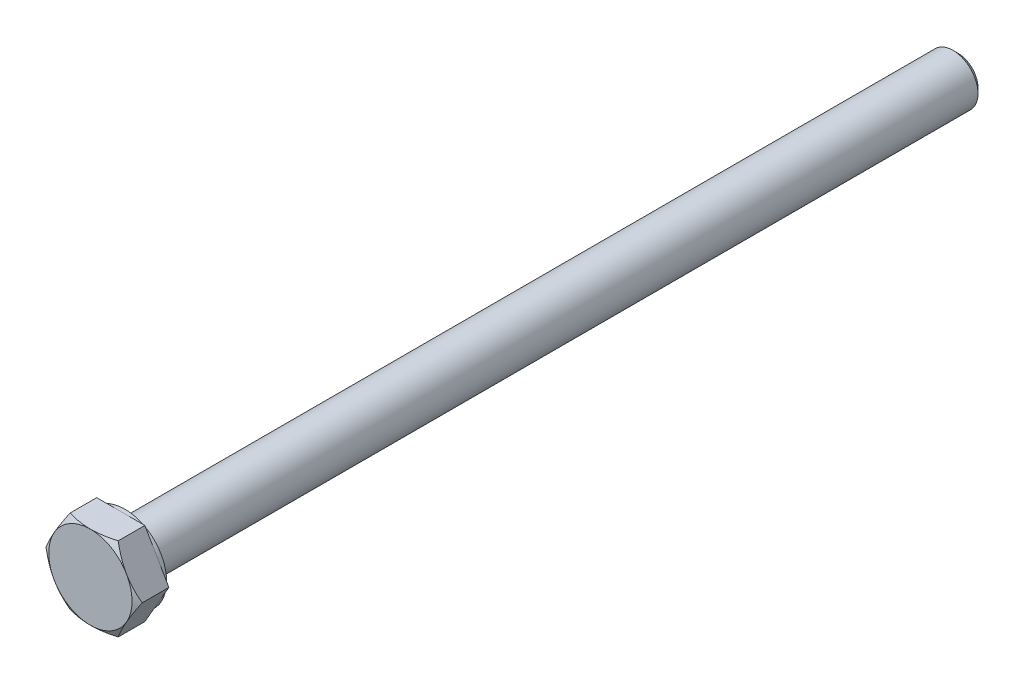
ISO-10303-21;
HEADER;
FILE_DESCRIPTION(('STEP AP214'),'2;1');
FILE_NAME('part.step','',(''),(''),'','','');
FILE_SCHEMA(('AUTOMOTIVE_DESIGN { 1 0 10303 214 1 1 1 1 }'));
ENDSEC;
DATA;
#1=APPLICATION_CONTEXT('core data for automotive mechanical design processes');
#2=APPLICATION_PROTOCOL_DEFINITION('international standard','automotive_design',2000,#1);
#3=PRODUCT_CONTEXT('',#1,'mechanical');
#4=PRODUCT('Part','Part','',(#3));
#5=PRODUCT_RELATED_PRODUCT_CATEGORY('part','',(#4));
#6=PRODUCT_DEFINITION_FORMATION('','',#4);
#7=PRODUCT_DEFINITION_CONTEXT('part definition',#1,'design');
#8=PRODUCT_DEFINITION('design','',#6,#7);
#9=PRODUCT_DEFINITION_SHAPE('','',#8);
#10=(LENGTH_UNIT() NAMED_UNIT(*) SI_UNIT(.MILLI.,.METRE.));
#11=(NAMED_UNIT(*) PLANE_ANGLE_UNIT() SI_UNIT($,.RADIAN.));
#12=(NAMED_UNIT(*) SI_UNIT($,.STERADIAN.) SOLID_ANGLE_UNIT());
#13=UNCERTAINTY_MEASURE_WITH_UNIT(LENGTH_MEASURE(1.E-05),#10,'distance_accuracy_value','');
#14=(GEOMETRIC_REPRESENTATION_CONTEXT(3) GLOBAL_UNCERTAINTY_ASSIGNED_CONTEXT((#13)) GLOBAL_UNIT_ASSIGNED_CONTEXT((#10,
#11,#12)) REPRESENTATION_CONTEXT('',''));
#15=CARTESIAN_POINT('',(0.,0.,0.));
#16=DIRECTION('',(0.,0.,1.));
#17=DIRECTION('',(1.,0.,0.));
#18=AXIS2_PLACEMENT_3D('',#15,#16,#17);
#19=CARTESIAN_POINT('',(0.,0.,4.15));
#20=DIRECTION('',(0.,0.,1.));
#21=DIRECTION('',(1.,0.,0.));
#22=AXIS2_PLACEMENT_3D('',#19,#20,#21);
#23=PLANE('',#22);
#24=CARTESIAN_POINT('',(0.,0.,4.15));
#25=DIRECTION('',(0.,0.,1.));
#26=DIRECTION('',(1.,0.,0.));
#27=AXIS2_PLACEMENT_3D('',#24,#25,#26);
#28=CIRCLE('',#27,5.);
#29=CARTESIAN_POINT('',(5.,0.,4.15));
#30=VERTEX_POINT('',#29);
#31=EDGE_CURVE('E10',#30,#30,#28,.T.);
#32=ORIENTED_EDGE('',*,*,#31,.T.);
#33=EDGE_LOOP('',(#32));
#34=FACE_BOUND('',#33,.T.);
#35=ADVANCED_FACE('F15',(#34),#23,.T.);
#36=CARTESIAN_POINT('',(0.,0.,4.15));
#37=DIRECTION('',(0.,0.,-1.));
#38=DIRECTION('',(1.,0.,0.));
#39=AXIS2_PLACEMENT_3D('',#36,#37,#38);
#40=CONICAL_SURFACE('',#39,5.,1.047197551197);
#41=CARTESIAN_POINT('',(2.8874999999992,5.00129670685568,3.70255354137743));
#42=CARTESIAN_POINT('',(4.33124999999986,2.50064835342825,4.53610299252072));
#43=CARTESIAN_POINT('',(5.77500000000043,9.62341317745086E-13,3.70255354137764));
#44=(BOUNDED_CURVE() B_SPLINE_CURVE(2,(#41,#42,#43),.UNSPECIFIED.,.F.,
.F.) B_SPLINE_CURVE_WITH_KNOTS((3,3),(0.,1.),
.UNSPECIFIED.) CURVE() GEOMETRIC_REPRESENTATION_ITEM() RATIONAL_B_SPLINE_CURVE((1.,
1.15470053837938,1.)) REPRESENTATION_ITEM(''));
#45=CARTESIAN_POINT('',(2.8875,5.001296706855,3.702553541378));
#46=VERTEX_POINT('',#45);
#47=CARTESIAN_POINT('',(5.775,0.,3.702553541378));
#48=VERTEX_POINT('',#47);
#49=EDGE_CURVE('E169',#46,#48,#44,.T.);
#50=ORIENTED_EDGE('',*,*,#49,.F.);
#51=CARTESIAN_POINT('',(-2.88750000000039,5.001296706855,3.70255354137778));
#52=CARTESIAN_POINT('',(-1.94066984704477E-13,5.00129670685504,4.53610299252048));
#53=CARTESIAN_POINT('',(2.88749999999987,5.001296706855,3.70255354137793));
#54=(BOUNDED_CURVE() B_SPLINE_CURVE(2,(#51,#52,#53),.UNSPECIFIED.,.F.,
.F.) B_SPLINE_CURVE_WITH_KNOTS((3,3),(0.,1.),
.UNSPECIFIED.) CURVE() GEOMETRIC_REPRESENTATION_ITEM() RATIONAL_B_SPLINE_CURVE((1.,
1.15470053837927,1.)) REPRESENTATION_ITEM(''));
#55=CARTESIAN_POINT('',(-2.8875,5.001296706855,3.702553541378));
#56=VERTEX_POINT('',#55);
#57=EDGE_CURVE('E178',#56,#46,#54,.T.);
#58=ORIENTED_EDGE('',*,*,#57,.F.);
#59=CARTESIAN_POINT('',(-5.7750000000016,-1.0627054791712E-12,3.70255354137697));
#60=CARTESIAN_POINT('',(-4.33125000000055,2.50064835342705,4.53610299252083));
#61=CARTESIAN_POINT('',(-2.88749999999986,5.00129670685454,3.70255354137781));
#62=(BOUNDED_CURVE() B_SPLINE_CURVE(2,(#59,#60,#61),.UNSPECIFIED.,.F.,
.F.) B_SPLINE_CURVE_WITH_KNOTS((3,3),(0.,1.),
.UNSPECIFIED.) CURVE() GEOMETRIC_REPRESENTATION_ITEM() RATIONAL_B_SPLINE_CURVE((1.,
1.15470053837943,1.)) REPRESENTATION_ITEM(''));
#63=CARTESIAN_POINT('',(-5.775,0.,3.702553541378));
#64=VERTEX_POINT('',#63);
#65=EDGE_CURVE('E184',#64,#56,#62,.T.);
#66=ORIENTED_EDGE('',*,*,#65,.F.);
#67=CARTESIAN_POINT('',(-2.8874999999992,-5.00129670685568,3.70255354137743));
#68=CARTESIAN_POINT('',(-4.33124999999987,-2.50064835342823,4.53610299252073));
#69=CARTESIAN_POINT('',(-5.77500000000045,-9.2104102122903E-13,3.70255354137763));
#70=(BOUNDED_CURVE() B_SPLINE_CURVE(2,(#67,#68,#69),.UNSPECIFIED.,.F.,
.F.) B_SPLINE_CURVE_WITH_KNOTS((3,3),(0.,1.),
.UNSPECIFIED.) CURVE() GEOMETRIC_REPRESENTATION_ITEM() RATIONAL_B_SPLINE_CURVE((1.,
1.15470053837938,1.)) REPRESENTATION_ITEM(''));
#71=CARTESIAN_POINT('',(-2.8875,-5.001296706855,3.702553541378));
#72=VERTEX_POINT('',#71);
#73=EDGE_CURVE('E199',#72,#64,#70,.T.);
#74=ORIENTED_EDGE('',*,*,#73,.F.);
#75=CARTESIAN_POINT('',(2.88750000000039,-5.001296706855,3.70255354137778));
#76=CARTESIAN_POINT('',(1.93622895494628E-13,-5.00129670685504,4.53610299252048));
#77=CARTESIAN_POINT('',(-2.88749999999987,-5.001296706855,3.70255354137793));
#78=(BOUNDED_CURVE() B_SPLINE_CURVE(2,(#75,#76,#77),.UNSPECIFIED.,.F.,
.F.) B_SPLINE_CURVE_WITH_KNOTS((3,3),(0.,1.),
.UNSPECIFIED.) CURVE() GEOMETRIC_REPRESENTATION_ITEM() RATIONAL_B_SPLINE_CURVE((1.,
1.15470053837927,1.)) REPRESENTATION_ITEM(''));
#79=CARTESIAN_POINT('',(2.8875,-5.001296706855,3.702553541378));
#80=VERTEX_POINT('',#79);
#81=EDGE_CURVE('E156',#80,#72,#78,.T.);
#82=ORIENTED_EDGE('',*,*,#81,.F.);
#83=CARTESIAN_POINT('',(5.77500000000167,1.18571819029967E-12,3.70255354137693));
#84=CARTESIAN_POINT('',(4.33125000000057,-2.50064835342701,4.53610299252084));
#85=CARTESIAN_POINT('',(2.88749999999986,-5.00129670685454,3.70255354137781));
#86=(BOUNDED_CURVE() B_SPLINE_CURVE(2,(#83,#84,#85),.UNSPECIFIED.,.F.,
.F.) B_SPLINE_CURVE_WITH_KNOTS((3,3),(0.,1.),
.UNSPECIFIED.) CURVE() GEOMETRIC_REPRESENTATION_ITEM() RATIONAL_B_SPLINE_CURVE((1.,
1.15470053837944,1.)) REPRESENTATION_ITEM(''));
#87=EDGE_CURVE('E40',#48,#80,#86,.T.);
#88=ORIENTED_EDGE('',*,*,#87,.F.);
#89=DIRECTION('',(0.866025403784329,0.,-0.50000000000019));
#90=VECTOR('',#89,1.);
#91=CARTESIAN_POINT('',(5.,0.,4.15));
#92=LINE('',#91,#90);
#93=EDGE_CURVE('E23',#30,#48,#92,.T.);
#94=ORIENTED_EDGE('',*,*,#93,.F.);
#95=ORIENTED_EDGE('',*,*,#31,.F.);
#96=ORIENTED_EDGE('',*,*,#93,.T.);
#97=EDGE_LOOP('',(#50,#58,#66,#74,#82,#88,#94,#95,#96));
#98=FACE_BOUND('',#97,.T.);
#99=ADVANCED_FACE('F218',(#98),#40,.T.);
#100=CARTESIAN_POINT('',(2.8875,-5.001296706855,0.));
#101=DIRECTION('',(-0.866025403784329,0.50000000000019,0.));
#102=DIRECTION('',(0.,0.,1.));
#103=AXIS2_PLACEMENT_3D('',#100,#101,#102);
#104=PLANE('',#103);
#105=DIRECTION('',(0.,0.,1.));
#106=VECTOR('',#105,1.);
#107=CARTESIAN_POINT('',(5.775,0.,0.5));
#108=LINE('',#107,#106);
#109=CARTESIAN_POINT('',(5.775,0.,0.5));
#110=VERTEX_POINT('',#109);
#111=EDGE_CURVE('E171',#110,#48,#108,.T.);
#112=ORIENTED_EDGE('',*,*,#111,.T.);
#113=ORIENTED_EDGE('',*,*,#87,.T.);
#114=DIRECTION('',(0.,0.,1.));
#115=VECTOR('',#114,1.);
#116=CARTESIAN_POINT('',(2.8875,-5.001296706855,0.));
#117=LINE('',#116,#115);
#118=CARTESIAN_POINT('',(2.8875,-5.001296706855,0.5));
#119=VERTEX_POINT('',#118);
#120=EDGE_CURVE('E161',#119,#80,#117,.T.);
#121=ORIENTED_EDGE('',*,*,#120,.F.);
#122=DIRECTION('',(0.50000000000019,0.866025403784329,0.));
#123=VECTOR('',#122,1.);
#124=CARTESIAN_POINT('',(3.609375,-3.750972530141,0.5));
#125=LINE('',#124,#123);
#126=EDGE_CURVE('E128',#119,#110,#125,.T.);
#127=ORIENTED_EDGE('',*,*,#126,.T.);
#128=EDGE_LOOP('',(#112,#113,#121,#127));
#129=FACE_BOUND('',#128,.T.);
#130=ADVANCED_FACE('F223',(#129),#104,.F.);
#131=CARTESIAN_POINT('',(-2.8875,-5.001296706855,0.));
#132=DIRECTION('',(0.,1.,0.));
#133=DIRECTION('',(1.,0.,0.));
#134=AXIS2_PLACEMENT_3D('',#131,#132,#133);
#135=PLANE('',#134);
#136=ORIENTED_EDGE('',*,*,#120,.T.);
#137=ORIENTED_EDGE('',*,*,#81,.T.);
#138=DIRECTION('',(0.,0.,1.));
#139=VECTOR('',#138,1.);
#140=CARTESIAN_POINT('',(-2.8875,-5.001296706855,0.));
#141=LINE('',#140,#139);
#142=CARTESIAN_POINT('',(-2.8875,-5.001296706855,0.5));
#143=VERTEX_POINT('',#142);
#144=EDGE_CURVE('E192',#143,#72,#141,.T.);
#145=ORIENTED_EDGE('',*,*,#144,.F.);
#146=DIRECTION('',(1.,0.,0.));
#147=VECTOR('',#146,1.);
#148=CARTESIAN_POINT('',(-1.44375,-5.001296706855,0.5));
#149=LINE('',#148,#147);
#150=EDGE_CURVE('E125',#143,#119,#149,.T.);
#151=ORIENTED_EDGE('',*,*,#150,.T.);
#152=EDGE_LOOP('',(#136,#137,#145,#151));
#153=FACE_BOUND('',#152,.T.);
#154=ADVANCED_FACE('F280',(#153),#135,.F.);
#155=CARTESIAN_POINT('',(-5.775,0.,0.));
#156=DIRECTION('',(0.866025403784329,0.50000000000019,0.));
#157=DIRECTION('',(0.,0.,-1.));
#158=AXIS2_PLACEMENT_3D('',#155,#156,#157);
#159=PLANE('',#158);
#160=ORIENTED_EDGE('',*,*,#144,.T.);
#161=ORIENTED_EDGE('',*,*,#73,.T.);
#162=DIRECTION('',(0.,0.,1.));
#163=VECTOR('',#162,1.);
#164=CARTESIAN_POINT('',(-5.775,0.,0.));
#165=LINE('',#164,#163);
#166=CARTESIAN_POINT('',(-5.775,0.,0.5));
#167=VERTEX_POINT('',#166);
#168=EDGE_CURVE('E183',#167,#64,#165,.T.);
#169=ORIENTED_EDGE('',*,*,#168,.F.);
#170=DIRECTION('',(0.50000000000019,-0.866025403784329,0.));
#171=VECTOR('',#170,1.);
#172=CARTESIAN_POINT('',(-5.053125,-1.250324176714,0.5));
#173=LINE('',#172,#171);
#174=EDGE_CURVE('E151',#167,#143,#173,.T.);
#175=ORIENTED_EDGE('',*,*,#174,.T.);
#176=EDGE_LOOP('',(#160,#161,#169,#175));
#177=FACE_BOUND('',#176,.T.);
#178=ADVANCED_FACE('F259',(#177),#159,.F.);
#179=CARTESIAN_POINT('',(-2.8875,5.001296706855,0.));
#180=DIRECTION('',(0.866025403784329,-0.50000000000019,0.));
#181=DIRECTION('',(0.,0.,-1.));
#182=AXIS2_PLACEMENT_3D('',#179,#180,#181);
#183=PLANE('',#182);
#184=ORIENTED_EDGE('',*,*,#168,.T.);
#185=ORIENTED_EDGE('',*,*,#65,.T.);
#186=DIRECTION('',(0.,0.,1.));
#187=VECTOR('',#186,1.);
#188=CARTESIAN_POINT('',(-2.8875,5.001296706855,0.));
#189=LINE('',#188,#187);
#190=CARTESIAN_POINT('',(-2.8875,5.001296706855,0.5));
#191=VERTEX_POINT('',#190);
#192=EDGE_CURVE('E174',#191,#56,#189,.T.);
#193=ORIENTED_EDGE('',*,*,#192,.F.);
#194=DIRECTION('',(-0.50000000000019,-0.866025403784329,0.));
#195=VECTOR('',#194,1.);
#196=CARTESIAN_POINT('',(-3.609375,3.750972530141,0.5));
#197=LINE('',#196,#195);
#198=EDGE_CURVE('E155',#191,#167,#197,.T.);
#199=ORIENTED_EDGE('',*,*,#198,.T.);
#200=EDGE_LOOP('',(#184,#185,#193,#199));
#201=FACE_BOUND('',#200,.T.);
#202=ADVANCED_FACE('F252',(#201),#183,.F.);
#203=CARTESIAN_POINT('',(2.8875,5.001296706855,0.));
#204=DIRECTION('',(0.,-1.,0.));
#205=DIRECTION('',(-1.,0.,0.));
#206=AXIS2_PLACEMENT_3D('',#203,#204,#205);
#207=PLANE('',#206);
#208=ORIENTED_EDGE('',*,*,#192,.T.);
#209=ORIENTED_EDGE('',*,*,#57,.T.);
#210=DIRECTION('',(0.,0.,1.));
#211=VECTOR('',#210,1.);
#212=CARTESIAN_POINT('',(2.8875,5.001296706855,0.));
#213=LINE('',#212,#211);
#214=CARTESIAN_POINT('',(2.8875,5.001296706855,0.5));
#215=VERTEX_POINT('',#214);
#216=EDGE_CURVE('E162',#215,#46,#213,.T.);
#217=ORIENTED_EDGE('',*,*,#216,.F.);
#218=DIRECTION('',(-1.,0.,0.));
#219=VECTOR('',#218,1.);
#220=CARTESIAN_POINT('',(1.44375,5.001296706855,0.5));
#221=LINE('',#220,#219);
#222=EDGE_CURVE('E170',#215,#191,#221,.T.);
#223=ORIENTED_EDGE('',*,*,#222,.T.);
#224=EDGE_LOOP('',(#208,#209,#217,#223));
#225=FACE_BOUND('',#224,.T.);
#226=ADVANCED_FACE('F262',(#225),#207,.F.);
#227=CARTESIAN_POINT('',(5.775,0.,0.));
#228=DIRECTION('',(-0.866025403784329,-0.50000000000019,0.));
#229=DIRECTION('',(-0.50000000000019,0.866025403784329,0.));
#230=AXIS2_PLACEMENT_3D('',#227,#228,#229);
#231=PLANE('',#230);
#232=ORIENTED_EDGE('',*,*,#216,.T.);
#233=ORIENTED_EDGE('',*,*,#49,.T.);
#234=ORIENTED_EDGE('',*,*,#111,.F.);
#235=DIRECTION('',(-0.50000000000019,0.866025403784329,0.));
#236=VECTOR('',#235,1.);
#237=CARTESIAN_POINT('',(5.053125,1.250324176714,0.5));
#238=LINE('',#237,#236);
#239=EDGE_CURVE('E132',#110,#215,#238,.T.);
#240=ORIENTED_EDGE('',*,*,#239,.T.);
#241=EDGE_LOOP('',(#232,#233,#234,#240));
#242=FACE_BOUND('',#241,.T.);
#243=ADVANCED_FACE('F227',(#242),#231,.F.);
#244=CARTESIAN_POINT('',(0.,0.,0.5));
#245=DIRECTION('',(0.,0.,1.));
#246=DIRECTION('',(1.,0.,0.));
#247=AXIS2_PLACEMENT_3D('',#244,#245,#246);
#248=PLANE('',#247);
#249=CARTESIAN_POINT('',(0.,0.,0.5));
#250=DIRECTION('',(0.,0.,1.));
#251=DIRECTION('',(1.,0.,0.));
#252=AXIS2_PLACEMENT_3D('',#249,#250,#251);
#253=CIRCLE('',#252,5.);
#254=CARTESIAN_POINT('',(5.,0.,0.5));
#255=VERTEX_POINT('',#254);
#256=EDGE_CURVE('E140',#255,#255,#253,.T.);
#257=ORIENTED_EDGE('',*,*,#256,.T.);
#258=EDGE_LOOP('',(#257));
#259=FACE_BOUND('',#258,.T.);
#260=ORIENTED_EDGE('',*,*,#239,.F.);
#261=ORIENTED_EDGE('',*,*,#126,.F.);
#262=ORIENTED_EDGE('',*,*,#150,.F.);
#263=ORIENTED_EDGE('',*,*,#174,.F.);
#264=ORIENTED_EDGE('',*,*,#198,.F.);
#265=ORIENTED_EDGE('',*,*,#222,.F.);
#266=EDGE_LOOP('',(#260,#261,#262,#263,#264,#265));
#267=FACE_BOUND('',#266,.T.);
#268=ADVANCED_FACE('F256',(#259,#267),#248,.F.);
#269=CARTESIAN_POINT('',(0.,0.,0.));
#270=DIRECTION('',(0.,0.,1.));
#271=DIRECTION('',(1.,0.,0.));
#272=AXIS2_PLACEMENT_3D('',#269,#270,#271);
#273=CYLINDRICAL_SURFACE('',#272,5.);
#274=CARTESIAN_POINT('',(0.,0.,0.));
#275=DIRECTION('',(0.,0.,1.));
#276=DIRECTION('',(1.,0.,0.));
#277=AXIS2_PLACEMENT_3D('',#274,#275,#276);
#278=CIRCLE('',#277,5.);
#279=CARTESIAN_POINT('',(5.,0.,0.));
#280=VERTEX_POINT('',#279);
#281=EDGE_CURVE('E141',#280,#280,#278,.T.);
#282=ORIENTED_EDGE('',*,*,#281,.T.);
#283=DIRECTION('',(0.,0.,1.));
#284=VECTOR('',#283,1.);
#285=CARTESIAN_POINT('',(5.,0.,0.));
#286=LINE('',#285,#284);
#287=EDGE_CURVE('E145',#280,#255,#286,.T.);
#288=ORIENTED_EDGE('',*,*,#287,.T.);
#289=ORIENTED_EDGE('',*,*,#256,.F.);
#290=ORIENTED_EDGE('',*,*,#287,.F.);
#291=EDGE_LOOP('',(#282,#288,#289,#290));
#292=FACE_BOUND('',#291,.T.);
#293=ADVANCED_FACE('F300',(#292),#273,.T.);
#294=CARTESIAN_POINT('',(0.,0.,0.));
#295=DIRECTION('',(0.,0.,1.));
#296=DIRECTION('',(1.,0.,0.));
#297=AXIS2_PLACEMENT_3D('',#294,#295,#296);
#298=PLANE('',#297);
#299=ORIENTED_EDGE('',*,*,#281,.F.);
#300=EDGE_LOOP('',(#299));
#301=FACE_BOUND('',#300,.T.);
#302=CARTESIAN_POINT('',(0.,0.,0.));
#303=DIRECTION('',(0.,0.,1.));
#304=DIRECTION('',(1.,0.,0.));
#305=AXIS2_PLACEMENT_3D('',#302,#303,#304);
#306=CIRCLE('',#305,3.);
#307=CARTESIAN_POINT('',(3.,0.,0.));
#308=VERTEX_POINT('',#307);
#309=EDGE_CURVE('E136',#308,#308,#306,.T.);
#310=ORIENTED_EDGE('',*,*,#309,.T.);
#311=EDGE_LOOP('',(#310));
#312=FACE_BOUND('',#311,.T.);
#313=ADVANCED_FACE('F296',(#301,#312),#298,.F.);
#314=CARTESIAN_POINT('',(0.,0.,-99.40000000005));
#315=DIRECTION('',(0.,0.,1.));
#316=DIRECTION('',(1.,0.,0.));
#317=AXIS2_PLACEMENT_3D('',#314,#315,#316);
#318=CYLINDRICAL_SURFACE('',#317,3.);
#319=CARTESIAN_POINT('',(0.,0.,-99.40000000005));
#320=DIRECTION('',(0.,0.,1.));
#321=DIRECTION('',(1.,0.,0.));
#322=AXIS2_PLACEMENT_3D('',#319,#320,#321);
#323=CIRCLE('',#322,3.);
#324=CARTESIAN_POINT('',(3.,0.,-99.40000000005));
#325=VERTEX_POINT('',#324);
#326=EDGE_CURVE('E114',#325,#325,#323,.T.);
#327=ORIENTED_EDGE('',*,*,#326,.T.);
#328=DIRECTION('',(0.,0.,1.));
#329=VECTOR('',#328,1.);
#330=CARTESIAN_POINT('',(3.,0.,-99.40000000005));
#331=LINE('',#330,#329);
#332=EDGE_CURVE('E120',#325,#308,#331,.T.);
#333=ORIENTED_EDGE('',*,*,#332,.T.);
#334=ORIENTED_EDGE('',*,*,#309,.F.);
#335=ORIENTED_EDGE('',*,*,#332,.F.);
#336=EDGE_LOOP('',(#327,#333,#334,#335));
#337=FACE_BOUND('',#336,.T.);
#338=ADVANCED_FACE('F293',(#337),#318,.T.);
#339=CARTESIAN_POINT('',(0.,0.,-100.));
#340=DIRECTION('',(0.,0.,1.));
#341=DIRECTION('',(1.,0.,0.));
#342=AXIS2_PLACEMENT_3D('',#339,#340,#341);
#343=CONICAL_SURFACE('',#342,2.4,0.785398163444);
#344=CARTESIAN_POINT('',(0.,0.,-100.));
#345=DIRECTION('',(0.,0.,1.));
#346=DIRECTION('',(1.,0.,0.));
#347=AXIS2_PLACEMENT_3D('',#344,#345,#346);
#348=CIRCLE('',#347,2.4);
#349=CARTESIAN_POINT('',(2.4,0.,-100.));
#350=VERTEX_POINT('',#349);
#351=EDGE_CURVE('E112',#350,#350,#348,.T.);
#352=ORIENTED_EDGE('',*,*,#351,.T.);
#353=DIRECTION('',(0.707106781219048,0.,0.707106781154048));
#354=VECTOR('',#353,1.);
#355=CARTESIAN_POINT('',(2.4,0.,-100.));
#356=LINE('',#355,#354);
#357=EDGE_CURVE('E109',#350,#325,#356,.T.);
#358=ORIENTED_EDGE('',*,*,#357,.T.);
#359=ORIENTED_EDGE('',*,*,#326,.F.);
#360=ORIENTED_EDGE('',*,*,#357,.F.);
#361=EDGE_LOOP('',(#352,#358,#359,#360));
#362=FACE_BOUND('',#361,.T.);
#363=ADVANCED_FACE('F110',(#362),#343,.T.);
#364=CARTESIAN_POINT('',(0.,0.,-100.));
#365=DIRECTION('',(0.,0.,1.));
#366=DIRECTION('',(1.,0.,0.));
#367=AXIS2_PLACEMENT_3D('',#364,#365,#366);
#368=PLANE('',#367);
#369=ORIENTED_EDGE('',*,*,#351,.F.);
#370=EDGE_LOOP('',(#369));
#371=FACE_BOUND('',#370,.T.);
#372=ADVANCED_FACE('F340',(#371),#368,.F.);
#373=CLOSED_SHELL('',(#35,#99,#130,#154,#178,#202,#226,#243,#268,#293,#313,#338,#363,#372));
#374=MANIFOLD_SOLID_BREP('B1',#373);
#375=ADVANCED_BREP_SHAPE_REPRESENTATION('',(#18,#374),#14);
#376=SHAPE_DEFINITION_REPRESENTATION(#9,#375);
ENDSEC;
END-ISO-10303-21;
